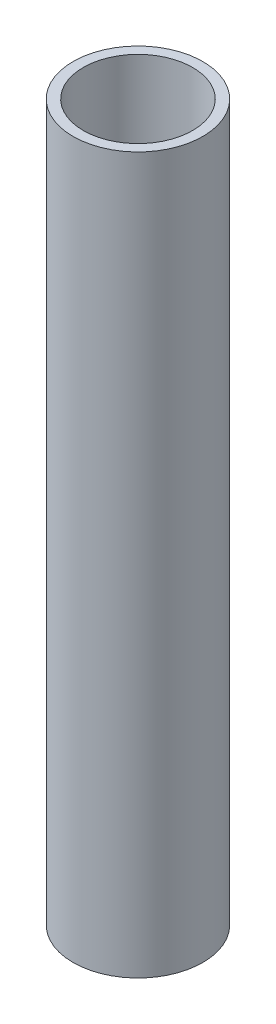
ISO-10303-21;
HEADER;
FILE_DESCRIPTION(('STEP AP214'),'2;1');
FILE_NAME('part.step','',(''),(''),'','','');
FILE_SCHEMA(('AUTOMOTIVE_DESIGN { 1 0 10303 214 1 1 1 1 }'));
ENDSEC;
DATA;
#1=APPLICATION_CONTEXT('core data for automotive mechanical design processes');
#2=APPLICATION_PROTOCOL_DEFINITION('international standard','automotive_design',2000,#1);
#3=PRODUCT_CONTEXT('',#1,'mechanical');
#4=PRODUCT('Part','Part','',(#3));
#5=PRODUCT_RELATED_PRODUCT_CATEGORY('part','',(#4));
#6=PRODUCT_DEFINITION_FORMATION('','',#4);
#7=PRODUCT_DEFINITION_CONTEXT('part definition',#1,'design');
#8=PRODUCT_DEFINITION('design','',#6,#7);
#9=PRODUCT_DEFINITION_SHAPE('','',#8);
#10=(LENGTH_UNIT() NAMED_UNIT(*) SI_UNIT(.MILLI.,.METRE.));
#11=(NAMED_UNIT(*) PLANE_ANGLE_UNIT() SI_UNIT($,.RADIAN.));
#12=(NAMED_UNIT(*) SI_UNIT($,.STERADIAN.) SOLID_ANGLE_UNIT());
#13=UNCERTAINTY_MEASURE_WITH_UNIT(LENGTH_MEASURE(1.E-05),#10,'distance_accuracy_value','');
#14=(GEOMETRIC_REPRESENTATION_CONTEXT(3) GLOBAL_UNCERTAINTY_ASSIGNED_CONTEXT((#13)) GLOBAL_UNIT_ASSIGNED_CONTEXT((#10,
#11,#12)) REPRESENTATION_CONTEXT('',''));
#15=CARTESIAN_POINT('',(0.,0.,0.));
#16=DIRECTION('',(0.,0.,1.));
#17=DIRECTION('',(1.,0.,0.));
#18=AXIS2_PLACEMENT_3D('',#15,#16,#17);
#19=CARTESIAN_POINT('',(0.,70.,0.));
#20=DIRECTION('',(0.,1.,0.));
#21=DIRECTION('',(0.,0.,1.));
#22=AXIS2_PLACEMENT_3D('',#19,#20,#21);
#23=PLANE('',#22);
#24=CARTESIAN_POINT('',(0.,70.,0.));
#25=DIRECTION('',(0.,1.,0.));
#26=DIRECTION('',(0.,0.,1.));
#27=AXIS2_PLACEMENT_3D('',#24,#25,#26);
#28=CIRCLE('',#27,6.35);
#29=CARTESIAN_POINT('',(0.,70.,6.35));
#30=VERTEX_POINT('',#29);
#31=EDGE_CURVE('E10',#30,#30,#28,.T.);
#32=ORIENTED_EDGE('',*,*,#31,.T.);
#33=EDGE_LOOP('',(#32));
#34=FACE_BOUND('',#33,.T.);
#35=CARTESIAN_POINT('',(0.,70.,0.));
#36=DIRECTION('',(0.,1.,0.));
#37=DIRECTION('',(0.,0.,1.));
#38=AXIS2_PLACEMENT_3D('',#35,#36,#37);
#39=CIRCLE('',#38,5.35);
#40=CARTESIAN_POINT('',(0.,70.,5.35));
#41=VERTEX_POINT('',#40);
#42=EDGE_CURVE('E52',#41,#41,#39,.T.);
#43=ORIENTED_EDGE('',*,*,#42,.F.);
#44=EDGE_LOOP('',(#43));
#45=FACE_BOUND('',#44,.T.);
#46=ADVANCED_FACE('F39',(#34,#45),#23,.T.);
#47=CARTESIAN_POINT('',(0.,0.,0.));
#48=DIRECTION('',(0.,1.,0.));
#49=DIRECTION('',(0.,0.,1.));
#50=AXIS2_PLACEMENT_3D('',#47,#48,#49);
#51=PLANE('',#50);
#52=CARTESIAN_POINT('',(0.,0.,0.));
#53=DIRECTION('',(0.,1.,0.));
#54=DIRECTION('',(0.,0.,1.));
#55=AXIS2_PLACEMENT_3D('',#52,#53,#54);
#56=CIRCLE('',#55,6.35);
#57=CARTESIAN_POINT('',(0.,0.,6.35));
#58=VERTEX_POINT('',#57);
#59=EDGE_CURVE('E43',#58,#58,#56,.T.);
#60=ORIENTED_EDGE('',*,*,#59,.F.);
#61=EDGE_LOOP('',(#60));
#62=FACE_BOUND('',#61,.T.);
#63=CARTESIAN_POINT('',(0.,0.,0.));
#64=DIRECTION('',(0.,1.,0.));
#65=DIRECTION('',(0.,0.,1.));
#66=AXIS2_PLACEMENT_3D('',#63,#64,#65);
#67=CIRCLE('',#66,5.35);
#68=CARTESIAN_POINT('',(0.,0.,5.35));
#69=VERTEX_POINT('',#68);
#70=EDGE_CURVE('E54',#69,#69,#67,.T.);
#71=ORIENTED_EDGE('',*,*,#70,.T.);
#72=EDGE_LOOP('',(#71));
#73=FACE_BOUND('',#72,.T.);
#74=ADVANCED_FACE('F66',(#62,#73),#51,.F.);
#75=CARTESIAN_POINT('',(0.,70.,0.));
#76=DIRECTION('',(0.,-1.,0.));
#77=DIRECTION('',(0.,0.,-1.));
#78=AXIS2_PLACEMENT_3D('',#75,#76,#77);
#79=CYLINDRICAL_SURFACE('',#78,6.35);
#80=ORIENTED_EDGE('',*,*,#31,.F.);
#81=EDGE_LOOP('',(#80));
#82=FACE_BOUND('',#81,.T.);
#83=ORIENTED_EDGE('',*,*,#59,.T.);
#84=EDGE_LOOP('',(#83));
#85=FACE_BOUND('',#84,.T.);
#86=ADVANCED_FACE('F41',(#82,#85),#79,.T.);
#87=CARTESIAN_POINT('',(0.,70.,0.));
#88=DIRECTION('',(0.,-1.,0.));
#89=DIRECTION('',(0.,0.,-1.));
#90=AXIS2_PLACEMENT_3D('',#87,#88,#89);
#91=CYLINDRICAL_SURFACE('',#90,5.35);
#92=ORIENTED_EDGE('',*,*,#42,.T.);
#93=EDGE_LOOP('',(#92));
#94=FACE_BOUND('',#93,.T.);
#95=ORIENTED_EDGE('',*,*,#70,.F.);
#96=EDGE_LOOP('',(#95));
#97=FACE_BOUND('',#96,.T.);
#98=ADVANCED_FACE('F62',(#94,#97),#91,.F.);
#99=CLOSED_SHELL('',(#46,#74,#86,#98));
#100=MANIFOLD_SOLID_BREP('B2',#99);
#101=ADVANCED_BREP_SHAPE_REPRESENTATION('',(#18,#100),#14);
#102=SHAPE_DEFINITION_REPRESENTATION(#9,#101);
ENDSEC;
END-ISO-10303-21;
